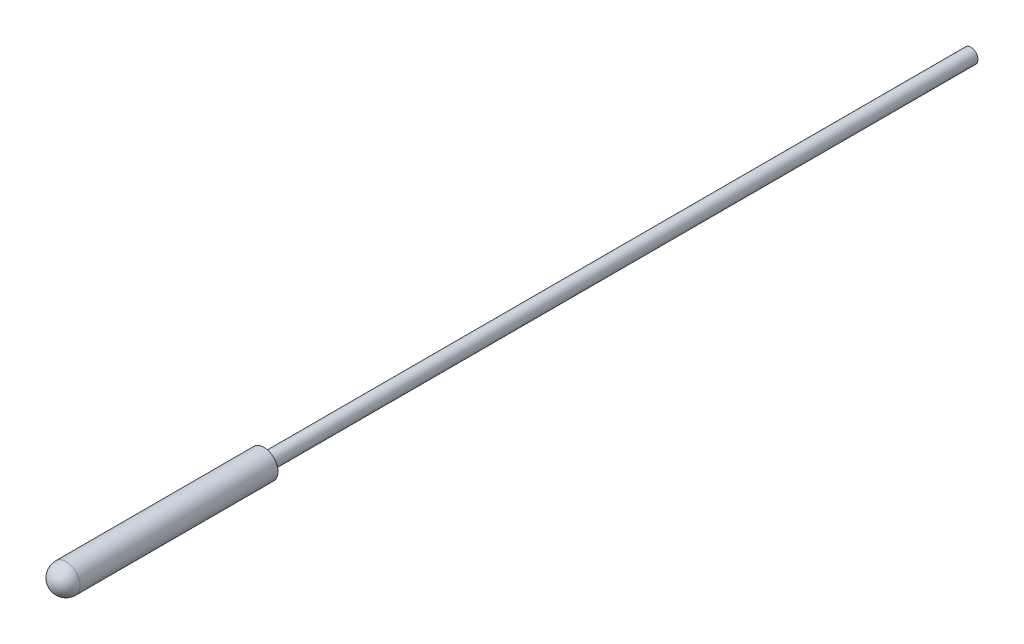
ISO-10303-21;
HEADER;
FILE_DESCRIPTION(('STEP AP214'),'2;1');
FILE_NAME('part.step','',(''),(''),'','','');
FILE_SCHEMA(('AUTOMOTIVE_DESIGN { 1 0 10303 214 1 1 1 1 }'));
ENDSEC;
DATA;
#1=APPLICATION_CONTEXT('core data for automotive mechanical design processes');
#2=APPLICATION_PROTOCOL_DEFINITION('international standard','automotive_design',2000,#1);
#3=PRODUCT_CONTEXT('',#1,'mechanical');
#4=PRODUCT('Part','Part','',(#3));
#5=PRODUCT_RELATED_PRODUCT_CATEGORY('part','',(#4));
#6=PRODUCT_DEFINITION_FORMATION('','',#4);
#7=PRODUCT_DEFINITION_CONTEXT('part definition',#1,'design');
#8=PRODUCT_DEFINITION('design','',#6,#7);
#9=PRODUCT_DEFINITION_SHAPE('','',#8);
#10=(LENGTH_UNIT() NAMED_UNIT(*) SI_UNIT(.MILLI.,.METRE.));
#11=(NAMED_UNIT(*) PLANE_ANGLE_UNIT() SI_UNIT($,.RADIAN.));
#12=(NAMED_UNIT(*) SI_UNIT($,.STERADIAN.) SOLID_ANGLE_UNIT());
#13=UNCERTAINTY_MEASURE_WITH_UNIT(LENGTH_MEASURE(1.E-05),#10,'distance_accuracy_value','');
#14=(GEOMETRIC_REPRESENTATION_CONTEXT(3) GLOBAL_UNCERTAINTY_ASSIGNED_CONTEXT((#13)) GLOBAL_UNIT_ASSIGNED_CONTEXT((#10,
#11,#12)) REPRESENTATION_CONTEXT('',''));
#15=CARTESIAN_POINT('',(0.,0.,0.));
#16=DIRECTION('',(0.,0.,1.));
#17=DIRECTION('',(1.,0.,0.));
#18=AXIS2_PLACEMENT_3D('',#15,#16,#17);
#19=CARTESIAN_POINT('',(0.,0.,30.));
#20=DIRECTION('',(0.,0.,-1.));
#21=DIRECTION('',(-1.,0.,0.));
#22=AXIS2_PLACEMENT_3D('',#19,#20,#21);
#23=CYLINDRICAL_SURFACE('',#22,2.);
#24=CARTESIAN_POINT('',(0.,0.,28.));
#25=DIRECTION('',(0.,0.,-1.));
#26=DIRECTION('',(-1.,0.,0.));
#27=AXIS2_PLACEMENT_3D('',#24,#25,#26);
#28=CIRCLE('',#27,2.);
#29=CARTESIAN_POINT('',(-2.,0.,28.));
#30=VERTEX_POINT('',#29);
#31=EDGE_CURVE('E43',#30,#30,#28,.T.);
#32=ORIENTED_EDGE('',*,*,#31,.T.);
#33=EDGE_LOOP('',(#32));
#34=FACE_BOUND('',#33,.T.);
#35=CARTESIAN_POINT('',(0.,0.,0.));
#36=DIRECTION('',(0.,0.,1.));
#37=DIRECTION('',(1.,0.,0.));
#38=AXIS2_PLACEMENT_3D('',#35,#36,#37);
#39=CIRCLE('',#38,2.);
#40=CARTESIAN_POINT('',(2.,0.,0.));
#41=VERTEX_POINT('',#40);
#42=EDGE_CURVE('E51',#41,#41,#39,.T.);
#43=ORIENTED_EDGE('',*,*,#42,.T.);
#44=EDGE_LOOP('',(#43));
#45=FACE_BOUND('',#44,.T.);
#46=ADVANCED_FACE('F39',(#34,#45),#23,.T.);
#47=CARTESIAN_POINT('',(0.,0.,0.));
#48=DIRECTION('',(0.,0.,1.));
#49=DIRECTION('',(1.,0.,0.));
#50=AXIS2_PLACEMENT_3D('',#47,#48,#49);
#51=PLANE('',#50);
#52=CARTESIAN_POINT('',(0.,0.,0.));
#53=DIRECTION('',(0.,0.,-1.));
#54=DIRECTION('',(-1.,0.,0.));
#55=AXIS2_PLACEMENT_3D('',#52,#53,#54);
#56=CIRCLE('',#55,1.01458534586087);
#57=CARTESIAN_POINT('',(-1.01458534586087,0.,0.));
#58=VERTEX_POINT('',#57);
#59=EDGE_CURVE('E10',#58,#58,#56,.T.);
#60=ORIENTED_EDGE('',*,*,#59,.F.);
#61=EDGE_LOOP('',(#60));
#62=FACE_BOUND('',#61,.T.);
#63=ORIENTED_EDGE('',*,*,#42,.F.);
#64=EDGE_LOOP('',(#63));
#65=FACE_BOUND('',#64,.T.);
#66=ADVANCED_FACE('F70',(#62,#65),#51,.F.);
#67=CARTESIAN_POINT('',(0.,0.,28.));
#68=DIRECTION('',(0.,0.,1.));
#69=DIRECTION('',(1.,0.,0.));
#70=AXIS2_PLACEMENT_3D('',#67,#68,#69);
#71=SPHERICAL_SURFACE('',#70,2.);
#72=ORIENTED_EDGE('',*,*,#31,.F.);
#73=EDGE_LOOP('',(#72));
#74=FACE_BOUND('',#73,.T.);
#75=ADVANCED_FACE('F41',(#74),#71,.T.);
#76=CARTESIAN_POINT('',(0.,0.,-100.));
#77=DIRECTION('',(0.,0.,1.));
#78=DIRECTION('',(1.,0.,0.));
#79=AXIS2_PLACEMENT_3D('',#76,#77,#78);
#80=CYLINDRICAL_SURFACE('',#79,1.01458534586087);
#81=CARTESIAN_POINT('',(0.,0.,-100.));
#82=DIRECTION('',(0.,0.,-1.));
#83=DIRECTION('',(-1.,0.,0.));
#84=AXIS2_PLACEMENT_3D('',#81,#82,#83);
#85=CIRCLE('',#84,1.01458534586087);
#86=CARTESIAN_POINT('',(-1.01458534586087,0.,-100.));
#87=VERTEX_POINT('',#86);
#88=EDGE_CURVE('E53',#87,#87,#85,.T.);
#89=ORIENTED_EDGE('',*,*,#88,.F.);
#90=EDGE_LOOP('',(#89));
#91=FACE_BOUND('',#90,.T.);
#92=ORIENTED_EDGE('',*,*,#59,.T.);
#93=EDGE_LOOP('',(#92));
#94=FACE_BOUND('',#93,.T.);
#95=ADVANCED_FACE('F62',(#91,#94),#80,.T.);
#96=CARTESIAN_POINT('',(0.,0.,-100.));
#97=DIRECTION('',(0.,0.,-1.));
#98=DIRECTION('',(-1.,0.,0.));
#99=AXIS2_PLACEMENT_3D('',#96,#97,#98);
#100=PLANE('',#99);
#101=ORIENTED_EDGE('',*,*,#88,.T.);
#102=EDGE_LOOP('',(#101));
#103=FACE_BOUND('',#102,.T.);
#104=ADVANCED_FACE('F60',(#103),#100,.T.);
#105=CLOSED_SHELL('',(#46,#66,#75,#95,#104));
#106=MANIFOLD_SOLID_BREP('B2',#105);
#107=ADVANCED_BREP_SHAPE_REPRESENTATION('',(#18,#106),#14);
#108=SHAPE_DEFINITION_REPRESENTATION(#9,#107);
ENDSEC;
END-ISO-10303-21;
